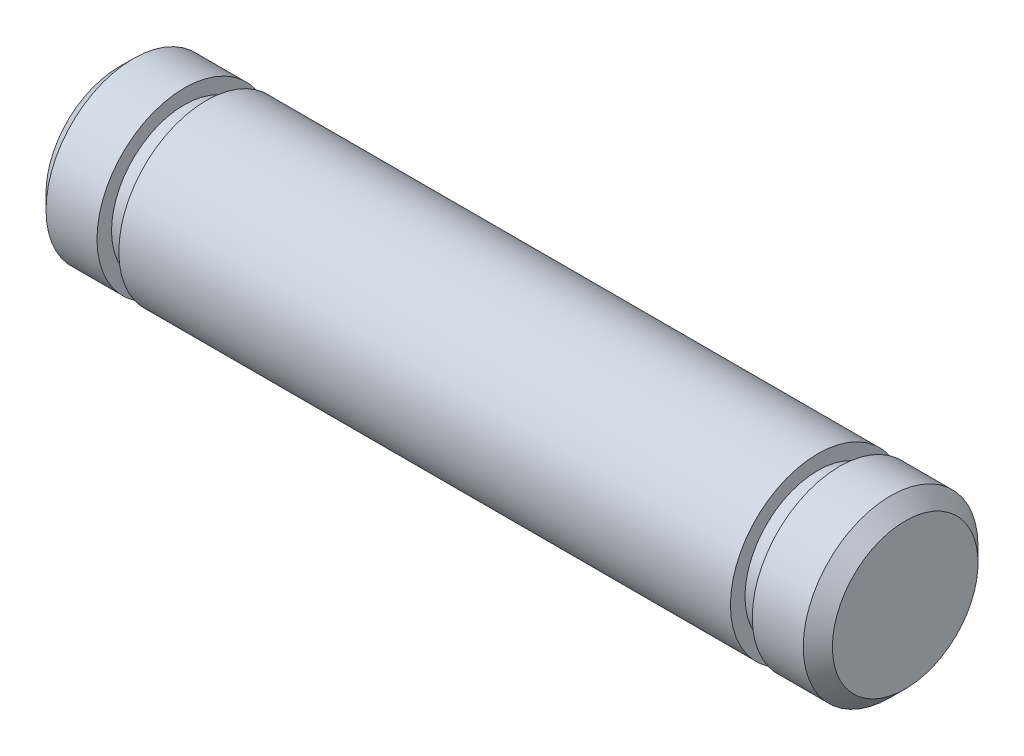
ISO-10303-21;
HEADER;
FILE_DESCRIPTION(('STEP AP214'),'2;1');
FILE_NAME('part.step','',(''),(''),'','','');
FILE_SCHEMA(('AUTOMOTIVE_DESIGN { 1 0 10303 214 1 1 1 1 }'));
ENDSEC;
DATA;
#1=APPLICATION_CONTEXT('core data for automotive mechanical design processes');
#2=APPLICATION_PROTOCOL_DEFINITION('international standard','automotive_design',2000,#1);
#3=PRODUCT_CONTEXT('',#1,'mechanical');
#4=PRODUCT('Part','Part','',(#3));
#5=PRODUCT_RELATED_PRODUCT_CATEGORY('part','',(#4));
#6=PRODUCT_DEFINITION_FORMATION('','',#4);
#7=PRODUCT_DEFINITION_CONTEXT('part definition',#1,'design');
#8=PRODUCT_DEFINITION('design','',#6,#7);
#9=PRODUCT_DEFINITION_SHAPE('','',#8);
#10=(LENGTH_UNIT() NAMED_UNIT(*) SI_UNIT(.MILLI.,.METRE.));
#11=(NAMED_UNIT(*) PLANE_ANGLE_UNIT() SI_UNIT($,.RADIAN.));
#12=(NAMED_UNIT(*) SI_UNIT($,.STERADIAN.) SOLID_ANGLE_UNIT());
#13=UNCERTAINTY_MEASURE_WITH_UNIT(LENGTH_MEASURE(1.E-05),#10,'distance_accuracy_value','');
#14=(GEOMETRIC_REPRESENTATION_CONTEXT(3) GLOBAL_UNCERTAINTY_ASSIGNED_CONTEXT((#13)) GLOBAL_UNIT_ASSIGNED_CONTEXT((#10,
#11,#12)) REPRESENTATION_CONTEXT('',''));
#15=CARTESIAN_POINT('',(0.,0.,0.));
#16=DIRECTION('',(0.,0.,1.));
#17=DIRECTION('',(1.,0.,0.));
#18=AXIS2_PLACEMENT_3D('',#15,#16,#17);
#19=CARTESIAN_POINT('',(27.,1.50000000000001,0.));
#20=DIRECTION('',(1.,0.,0.));
#21=DIRECTION('',(0.,0.,-1.));
#22=AXIS2_PLACEMENT_3D('',#19,#20,#21);
#23=PLANE('',#22);
#24=CARTESIAN_POINT('',(27.0000000002142,0.,0.));
#25=DIRECTION('',(-1.,0.,0.));
#26=DIRECTION('',(0.,0.,1.));
#27=AXIS2_PLACEMENT_3D('',#24,#25,#26);
#28=CIRCLE('',#27,2.50000000022511);
#29=CARTESIAN_POINT('',(27.0000000002142,0.,2.50000000022511));
#30=VERTEX_POINT('',#29);
#31=EDGE_CURVE('E18',#30,#30,#28,.T.);
#32=ORIENTED_EDGE('',*,*,#31,.F.);
#33=EDGE_LOOP('',(#32));
#34=FACE_BOUND('',#33,.T.);
#35=ADVANCED_FACE('F15',(#34),#23,.T.);
#36=CARTESIAN_POINT('',(0.,1.5,0.));
#37=DIRECTION('',(-1.,0.,0.));
#38=DIRECTION('',(0.,0.,1.));
#39=AXIS2_PLACEMENT_3D('',#36,#37,#38);
#40=PLANE('',#39);
#41=CARTESIAN_POINT('',(-2.27374217544318E-10,0.,0.));
#42=DIRECTION('',(1.,0.,0.));
#43=DIRECTION('',(0.,1.,0.));
#44=AXIS2_PLACEMENT_3D('',#41,#42,#43);
#45=CIRCLE('',#44,2.5000000002251);
#46=CARTESIAN_POINT('',(-2.27374849995586E-10,2.5000000002251,0.));
#47=VERTEX_POINT('',#46);
#48=EDGE_CURVE('E50',#47,#47,#45,.T.);
#49=ORIENTED_EDGE('',*,*,#48,.F.);
#50=EDGE_LOOP('',(#49));
#51=FACE_BOUND('',#50,.T.);
#52=ADVANCED_FACE('F63',(#51),#40,.T.);
#53=CARTESIAN_POINT('',(26.4999999998849,0.,0.));
#54=DIRECTION('',(-1.,0.,0.));
#55=DIRECTION('',(0.,0.,1.));
#56=AXIS2_PLACEMENT_3D('',#53,#54,#55);
#57=CONICAL_SURFACE('',#56,2.99999999964485,0.785398162487954);
#58=ORIENTED_EDGE('',*,*,#31,.T.);
#59=EDGE_LOOP('',(#58));
#60=FACE_BOUND('',#59,.T.);
#61=CARTESIAN_POINT('',(26.5,0.,0.));
#62=DIRECTION('',(1.,0.,0.));
#63=DIRECTION('',(0.,1.,0.));
#64=AXIS2_PLACEMENT_3D('',#61,#62,#63);
#65=CIRCLE('',#64,3.);
#66=CARTESIAN_POINT('',(26.5,3.00000000000001,0.));
#67=VERTEX_POINT('',#66);
#68=EDGE_CURVE('E52',#67,#67,#65,.F.);
#69=ORIENTED_EDGE('',*,*,#68,.F.);
#70=EDGE_LOOP('',(#69));
#71=FACE_BOUND('',#70,.T.);
#72=ADVANCED_FACE('F59',(#60,#71),#57,.T.);
#73=CARTESIAN_POINT('',(0.500000000215549,0.,0.));
#74=DIRECTION('',(1.,0.,0.));
#75=DIRECTION('',(0.,1.,0.));
#76=AXIS2_PLACEMENT_3D('',#73,#74,#75);
#77=CONICAL_SURFACE('',#76,2.99999999975853,0.785398162487954);
#78=CARTESIAN_POINT('',(0.5,0.,0.));
#79=DIRECTION('',(1.,0.,0.));
#80=DIRECTION('',(0.,1.,0.));
#81=AXIS2_PLACEMENT_3D('',#78,#79,#80);
#82=CIRCLE('',#81,3.);
#83=CARTESIAN_POINT('',(0.499999999999999,3.,0.));
#84=VERTEX_POINT('',#83);
#85=EDGE_CURVE('E49',#84,#84,#82,.T.);
#86=ORIENTED_EDGE('',*,*,#85,.F.);
#87=EDGE_LOOP('',(#86));
#88=FACE_BOUND('',#87,.T.);
#89=ORIENTED_EDGE('',*,*,#48,.T.);
#90=EDGE_LOOP('',(#89));
#91=FACE_BOUND('',#90,.T.);
#92=ADVANCED_FACE('F107',(#88,#91),#77,.T.);
#93=CARTESIAN_POINT('',(25.875,0.,0.));
#94=DIRECTION('',(1.,0.,0.));
#95=DIRECTION('',(0.,1.,0.));
#96=AXIS2_PLACEMENT_3D('',#93,#94,#95);
#97=CYLINDRICAL_SURFACE('',#96,3.);
#98=ORIENTED_EDGE('',*,*,#68,.T.);
#99=EDGE_LOOP('',(#98));
#100=FACE_BOUND('',#99,.T.);
#101=CARTESIAN_POINT('',(24.75,0.,0.));
#102=DIRECTION('',(1.,0.,0.));
#103=DIRECTION('',(0.,1.,0.));
#104=AXIS2_PLACEMENT_3D('',#101,#102,#103);
#105=CIRCLE('',#104,3.);
#106=CARTESIAN_POINT('',(24.75,3.00000000000001,0.));
#107=VERTEX_POINT('',#106);
#108=EDGE_CURVE('E47',#107,#107,#105,.F.);
#109=ORIENTED_EDGE('',*,*,#108,.F.);
#110=EDGE_LOOP('',(#109));
#111=FACE_BOUND('',#110,.T.);
#112=ADVANCED_FACE('F103',(#100,#111),#97,.T.);
#113=CARTESIAN_POINT('',(1.125,0.,0.));
#114=DIRECTION('',(1.,0.,0.));
#115=DIRECTION('',(0.,1.,0.));
#116=AXIS2_PLACEMENT_3D('',#113,#114,#115);
#117=CYLINDRICAL_SURFACE('',#116,3.);
#118=ORIENTED_EDGE('',*,*,#85,.T.);
#119=EDGE_LOOP('',(#118));
#120=FACE_BOUND('',#119,.T.);
#121=CARTESIAN_POINT('',(2.25,0.,0.));
#122=DIRECTION('',(1.,0.,0.));
#123=DIRECTION('',(0.,1.,0.));
#124=AXIS2_PLACEMENT_3D('',#121,#122,#123);
#125=CIRCLE('',#124,3.);
#126=CARTESIAN_POINT('',(2.25,3.,0.));
#127=VERTEX_POINT('',#126);
#128=EDGE_CURVE('E44',#127,#127,#125,.T.);
#129=ORIENTED_EDGE('',*,*,#128,.F.);
#130=EDGE_LOOP('',(#129));
#131=FACE_BOUND('',#130,.T.);
#132=ADVANCED_FACE('F99',(#120,#131),#117,.T.);
#133=CARTESIAN_POINT('',(24.75,2.75000000000001,0.));
#134=DIRECTION('',(-1.,0.,0.));
#135=DIRECTION('',(0.,0.,1.));
#136=AXIS2_PLACEMENT_3D('',#133,#134,#135);
#137=PLANE('',#136);
#138=CARTESIAN_POINT('',(24.75,0.,0.));
#139=DIRECTION('',(1.,0.,0.));
#140=DIRECTION('',(0.,1.,0.));
#141=AXIS2_PLACEMENT_3D('',#138,#139,#140);
#142=CIRCLE('',#141,2.5);
#143=CARTESIAN_POINT('',(24.75,2.50000000000001,0.));
#144=VERTEX_POINT('',#143);
#145=EDGE_CURVE('E41',#144,#144,#142,.F.);
#146=ORIENTED_EDGE('',*,*,#145,.F.);
#147=EDGE_LOOP('',(#146));
#148=FACE_BOUND('',#147,.T.);
#149=ORIENTED_EDGE('',*,*,#108,.T.);
#150=EDGE_LOOP('',(#149));
#151=FACE_BOUND('',#150,.T.);
#152=ADVANCED_FACE('F95',(#148,#151),#137,.T.);
#153=CARTESIAN_POINT('',(2.25,2.75,0.));
#154=DIRECTION('',(1.,0.,0.));
#155=DIRECTION('',(0.,0.,-1.));
#156=AXIS2_PLACEMENT_3D('',#153,#154,#155);
#157=PLANE('',#156);
#158=CARTESIAN_POINT('',(2.25,0.,0.));
#159=DIRECTION('',(1.,0.,0.));
#160=DIRECTION('',(0.,1.,0.));
#161=AXIS2_PLACEMENT_3D('',#158,#159,#160);
#162=CIRCLE('',#161,2.5);
#163=CARTESIAN_POINT('',(2.25,2.5,0.));
#164=VERTEX_POINT('',#163);
#165=EDGE_CURVE('E38',#164,#164,#162,.T.);
#166=ORIENTED_EDGE('',*,*,#165,.F.);
#167=EDGE_LOOP('',(#166));
#168=FACE_BOUND('',#167,.T.);
#169=ORIENTED_EDGE('',*,*,#128,.T.);
#170=EDGE_LOOP('',(#169));
#171=FACE_BOUND('',#170,.T.);
#172=ADVANCED_FACE('F91',(#168,#171),#157,.T.);
#173=CARTESIAN_POINT('',(24.375,0.,0.));
#174=DIRECTION('',(1.,0.,0.));
#175=DIRECTION('',(0.,1.,0.));
#176=AXIS2_PLACEMENT_3D('',#173,#174,#175);
#177=CYLINDRICAL_SURFACE('',#176,2.5);
#178=CARTESIAN_POINT('',(24.,0.,0.));
#179=DIRECTION('',(1.,0.,0.));
#180=DIRECTION('',(0.,1.,0.));
#181=AXIS2_PLACEMENT_3D('',#178,#179,#180);
#182=CIRCLE('',#181,2.5);
#183=CARTESIAN_POINT('',(24.,2.50000000000001,0.));
#184=VERTEX_POINT('',#183);
#185=EDGE_CURVE('E35',#184,#184,#182,.F.);
#186=ORIENTED_EDGE('',*,*,#185,.F.);
#187=EDGE_LOOP('',(#186));
#188=FACE_BOUND('',#187,.T.);
#189=ORIENTED_EDGE('',*,*,#145,.T.);
#190=EDGE_LOOP('',(#189));
#191=FACE_BOUND('',#190,.T.);
#192=ADVANCED_FACE('F87',(#188,#191),#177,.T.);
#193=CARTESIAN_POINT('',(2.625,0.,0.));
#194=DIRECTION('',(1.,0.,0.));
#195=DIRECTION('',(0.,1.,0.));
#196=AXIS2_PLACEMENT_3D('',#193,#194,#195);
#197=CYLINDRICAL_SURFACE('',#196,2.5);
#198=ORIENTED_EDGE('',*,*,#165,.T.);
#199=EDGE_LOOP('',(#198));
#200=FACE_BOUND('',#199,.T.);
#201=CARTESIAN_POINT('',(3.,0.,0.));
#202=DIRECTION('',(1.,0.,0.));
#203=DIRECTION('',(0.,1.,0.));
#204=AXIS2_PLACEMENT_3D('',#201,#202,#203);
#205=CIRCLE('',#204,2.5);
#206=CARTESIAN_POINT('',(3.,2.5,0.));
#207=VERTEX_POINT('',#206);
#208=EDGE_CURVE('E27',#207,#207,#205,.T.);
#209=ORIENTED_EDGE('',*,*,#208,.F.);
#210=EDGE_LOOP('',(#209));
#211=FACE_BOUND('',#210,.T.);
#212=ADVANCED_FACE('F83',(#200,#211),#197,.T.);
#213=CARTESIAN_POINT('',(24.,2.75000000000001,0.));
#214=DIRECTION('',(1.,0.,0.));
#215=DIRECTION('',(0.,0.,-1.));
#216=AXIS2_PLACEMENT_3D('',#213,#214,#215);
#217=PLANE('',#216);
#218=ORIENTED_EDGE('',*,*,#185,.T.);
#219=EDGE_LOOP('',(#218));
#220=FACE_BOUND('',#219,.T.);
#221=CARTESIAN_POINT('',(24.,0.,0.));
#222=DIRECTION('',(1.,0.,0.));
#223=DIRECTION('',(0.,1.,0.));
#224=AXIS2_PLACEMENT_3D('',#221,#222,#223);
#225=CIRCLE('',#224,3.);
#226=CARTESIAN_POINT('',(24.,3.00000000000001,0.));
#227=VERTEX_POINT('',#226);
#228=EDGE_CURVE('E22',#227,#227,#225,.F.);
#229=ORIENTED_EDGE('',*,*,#228,.F.);
#230=EDGE_LOOP('',(#229));
#231=FACE_BOUND('',#230,.T.);
#232=ADVANCED_FACE('F76',(#220,#231),#217,.T.);
#233=CARTESIAN_POINT('',(3.,2.75,0.));
#234=DIRECTION('',(-1.,0.,0.));
#235=DIRECTION('',(0.,0.,1.));
#236=AXIS2_PLACEMENT_3D('',#233,#234,#235);
#237=PLANE('',#236);
#238=ORIENTED_EDGE('',*,*,#208,.T.);
#239=EDGE_LOOP('',(#238));
#240=FACE_BOUND('',#239,.T.);
#241=CARTESIAN_POINT('',(3.,0.,0.));
#242=DIRECTION('',(1.,0.,0.));
#243=DIRECTION('',(0.,1.,0.));
#244=AXIS2_PLACEMENT_3D('',#241,#242,#243);
#245=CIRCLE('',#244,3.);
#246=CARTESIAN_POINT('',(2.99999999999999,3.,0.));
#247=VERTEX_POINT('',#246);
#248=EDGE_CURVE('E10',#247,#247,#245,.T.);
#249=ORIENTED_EDGE('',*,*,#248,.F.);
#250=EDGE_LOOP('',(#249));
#251=FACE_BOUND('',#250,.T.);
#252=ADVANCED_FACE('F71',(#240,#251),#237,.T.);
#253=CARTESIAN_POINT('',(13.5,0.,0.));
#254=DIRECTION('',(1.,0.,0.));
#255=DIRECTION('',(0.,1.,0.));
#256=AXIS2_PLACEMENT_3D('',#253,#254,#255);
#257=CYLINDRICAL_SURFACE('',#256,3.);
#258=ORIENTED_EDGE('',*,*,#248,.T.);
#259=EDGE_LOOP('',(#258));
#260=FACE_BOUND('',#259,.T.);
#261=ORIENTED_EDGE('',*,*,#228,.T.);
#262=EDGE_LOOP('',(#261));
#263=FACE_BOUND('',#262,.T.);
#264=ADVANCED_FACE('F69',(#260,#263),#257,.T.);
#265=CLOSED_SHELL('',(#35,#52,#72,#92,#112,#132,#152,#172,#192,#212,#232,#252,#264));
#266=MANIFOLD_SOLID_BREP('B1',#265);
#267=ADVANCED_BREP_SHAPE_REPRESENTATION('',(#18,#266),#14);
#268=SHAPE_DEFINITION_REPRESENTATION(#9,#267);
ENDSEC;
END-ISO-10303-21;
